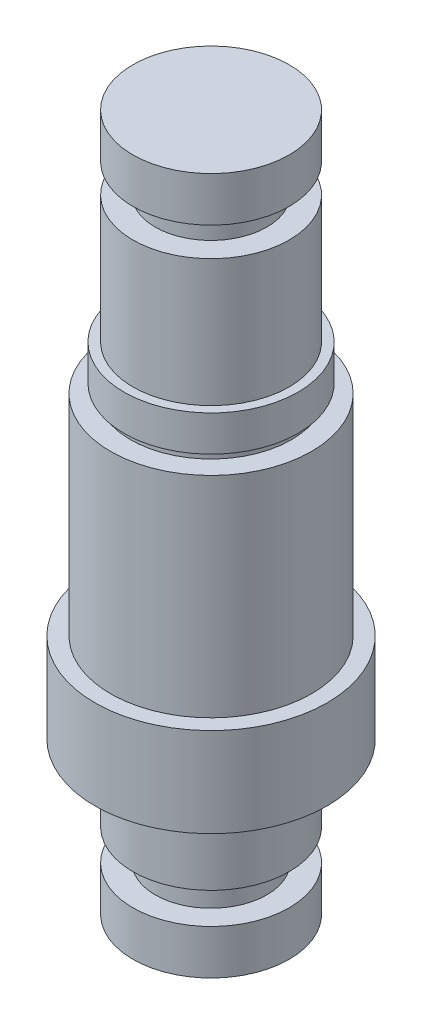
ISO-10303-21;
HEADER;
FILE_DESCRIPTION(('STEP AP214'),'2;1');
FILE_NAME('part.step','',(''),(''),'','','');
FILE_SCHEMA(('AUTOMOTIVE_DESIGN { 1 0 10303 214 1 1 1 1 }'));
ENDSEC;
DATA;
#1=APPLICATION_CONTEXT('core data for automotive mechanical design processes');
#2=APPLICATION_PROTOCOL_DEFINITION('international standard','automotive_design',2000,#1);
#3=PRODUCT_CONTEXT('',#1,'mechanical');
#4=PRODUCT('Part','Part','',(#3));
#5=PRODUCT_RELATED_PRODUCT_CATEGORY('part','',(#4));
#6=PRODUCT_DEFINITION_FORMATION('','',#4);
#7=PRODUCT_DEFINITION_CONTEXT('part definition',#1,'design');
#8=PRODUCT_DEFINITION('design','',#6,#7);
#9=PRODUCT_DEFINITION_SHAPE('','',#8);
#10=(LENGTH_UNIT() NAMED_UNIT(*) SI_UNIT(.MILLI.,.METRE.));
#11=(NAMED_UNIT(*) PLANE_ANGLE_UNIT() SI_UNIT($,.RADIAN.));
#12=(NAMED_UNIT(*) SI_UNIT($,.STERADIAN.) SOLID_ANGLE_UNIT());
#13=UNCERTAINTY_MEASURE_WITH_UNIT(LENGTH_MEASURE(1.E-05),#10,'distance_accuracy_value','');
#14=(GEOMETRIC_REPRESENTATION_CONTEXT(3) GLOBAL_UNCERTAINTY_ASSIGNED_CONTEXT((#13)) GLOBAL_UNIT_ASSIGNED_CONTEXT((#10,
#11,#12)) REPRESENTATION_CONTEXT('',''));
#15=CARTESIAN_POINT('',(0.,0.,0.));
#16=DIRECTION('',(0.,0.,1.));
#17=DIRECTION('',(1.,0.,0.));
#18=AXIS2_PLACEMENT_3D('',#15,#16,#17);
#19=CARTESIAN_POINT('',(0.,0.,0.));
#20=DIRECTION('',(0.,-1.,0.));
#21=DIRECTION('',(1.,0.,0.));
#22=AXIS2_PLACEMENT_3D('',#19,#20,#21);
#23=PLANE('',#22);
#24=CARTESIAN_POINT('',(0.,-1.11022302462516E-13,0.));
#25=DIRECTION('',(0.,-1.,0.));
#26=DIRECTION('',(1.,0.,0.));
#27=AXIS2_PLACEMENT_3D('',#24,#25,#26);
#28=CIRCLE('',#27,17.5);
#29=CARTESIAN_POINT('',(17.5,0.,0.));
#30=VERTEX_POINT('',#29);
#31=EDGE_CURVE('E10',#30,#30,#28,.T.);
#32=ORIENTED_EDGE('',*,*,#31,.T.);
#33=EDGE_LOOP('',(#32));
#34=FACE_BOUND('',#33,.T.);
#35=ADVANCED_FACE('F30',(#34),#23,.T.);
#36=CARTESIAN_POINT('',(3.49148336110938E-12,-1000.,0.));
#37=DIRECTION('',(0.,-1.,0.));
#38=DIRECTION('',(1.,0.,0.));
#39=AXIS2_PLACEMENT_3D('',#36,#37,#38);
#40=CYLINDRICAL_SURFACE('',#39,17.5);
#41=CARTESIAN_POINT('',(0.,10.,0.));
#42=DIRECTION('',(0.,-1.,0.));
#43=DIRECTION('',(1.,0.,0.));
#44=AXIS2_PLACEMENT_3D('',#41,#42,#43);
#45=CIRCLE('',#44,17.5);
#46=CARTESIAN_POINT('',(17.5,10.0000000000001,0.));
#47=VERTEX_POINT('',#46);
#48=EDGE_CURVE('E36',#47,#47,#45,.T.);
#49=ORIENTED_EDGE('',*,*,#48,.T.);
#50=EDGE_LOOP('',(#49));
#51=FACE_BOUND('',#50,.T.);
#52=ORIENTED_EDGE('',*,*,#31,.F.);
#53=EDGE_LOOP('',(#52));
#54=FACE_BOUND('',#53,.T.);
#55=ADVANCED_FACE('F110',(#51,#54),#40,.T.);
#56=CARTESIAN_POINT('',(17.5,10.,0.));
#57=DIRECTION('',(0.,1.,0.));
#58=DIRECTION('',(-1.,0.,0.));
#59=AXIS2_PLACEMENT_3D('',#56,#57,#58);
#60=PLANE('',#59);
#61=CARTESIAN_POINT('',(0.,10.,0.));
#62=DIRECTION('',(0.,-1.,0.));
#63=DIRECTION('',(1.,0.,0.));
#64=AXIS2_PLACEMENT_3D('',#61,#62,#63);
#65=CIRCLE('',#64,12.5);
#66=CARTESIAN_POINT('',(12.5,10.0000000000001,0.));
#67=VERTEX_POINT('',#66);
#68=EDGE_CURVE('E40',#67,#67,#65,.T.);
#69=ORIENTED_EDGE('',*,*,#68,.T.);
#70=EDGE_LOOP('',(#69));
#71=FACE_BOUND('',#70,.T.);
#72=ORIENTED_EDGE('',*,*,#48,.F.);
#73=EDGE_LOOP('',(#72));
#74=FACE_BOUND('',#73,.T.);
#75=ADVANCED_FACE('F114',(#71,#74),#60,.T.);
#76=CARTESIAN_POINT('',(3.49148336110938E-12,-1000.,0.));
#77=DIRECTION('',(0.,-1.,0.));
#78=DIRECTION('',(1.,0.,0.));
#79=AXIS2_PLACEMENT_3D('',#76,#77,#78);
#80=CYLINDRICAL_SURFACE('',#79,12.5);
#81=CARTESIAN_POINT('',(0.,16.9999999999999,0.));
#82=DIRECTION('',(0.,-1.,0.));
#83=DIRECTION('',(1.,0.,0.));
#84=AXIS2_PLACEMENT_3D('',#81,#82,#83);
#85=CIRCLE('',#84,12.5000000000001);
#86=CARTESIAN_POINT('',(12.5,17.,0.));
#87=VERTEX_POINT('',#86);
#88=EDGE_CURVE('E44',#87,#87,#85,.T.);
#89=ORIENTED_EDGE('',*,*,#88,.T.);
#90=EDGE_LOOP('',(#89));
#91=FACE_BOUND('',#90,.T.);
#92=ORIENTED_EDGE('',*,*,#68,.F.);
#93=EDGE_LOOP('',(#92));
#94=FACE_BOUND('',#93,.T.);
#95=ADVANCED_FACE('F118',(#91,#94),#80,.T.);
#96=CARTESIAN_POINT('',(12.5,17.,0.));
#97=DIRECTION('',(0.,-1.,0.));
#98=DIRECTION('',(1.,0.,0.));
#99=AXIS2_PLACEMENT_3D('',#96,#97,#98);
#100=PLANE('',#99);
#101=CARTESIAN_POINT('',(0.,16.9999999999999,0.));
#102=DIRECTION('',(0.,-1.,0.));
#103=DIRECTION('',(1.,0.,0.));
#104=AXIS2_PLACEMENT_3D('',#101,#102,#103);
#105=CIRCLE('',#104,17.5000000000001);
#106=CARTESIAN_POINT('',(17.5,17.,0.));
#107=VERTEX_POINT('',#106);
#108=EDGE_CURVE('E49',#107,#107,#105,.T.);
#109=ORIENTED_EDGE('',*,*,#108,.T.);
#110=EDGE_LOOP('',(#109));
#111=FACE_BOUND('',#110,.T.);
#112=ORIENTED_EDGE('',*,*,#88,.F.);
#113=EDGE_LOOP('',(#112));
#114=FACE_BOUND('',#113,.T.);
#115=ADVANCED_FACE('F125',(#111,#114),#100,.T.);
#116=CARTESIAN_POINT('',(3.49148336110938E-12,-1000.,0.));
#117=DIRECTION('',(0.,-1.,0.));
#118=DIRECTION('',(1.,0.,0.));
#119=AXIS2_PLACEMENT_3D('',#116,#117,#118);
#120=CYLINDRICAL_SURFACE('',#119,17.5000000000001);
#121=CARTESIAN_POINT('',(-1.18710434277719E-13,34.,0.));
#122=DIRECTION('',(0.,-1.,0.));
#123=DIRECTION('',(1.,0.,0.));
#124=AXIS2_PLACEMENT_3D('',#121,#122,#123);
#125=CIRCLE('',#124,17.5000000000001);
#126=CARTESIAN_POINT('',(17.5,34.0000000000001,0.));
#127=VERTEX_POINT('',#126);
#128=EDGE_CURVE('E52',#127,#127,#125,.T.);
#129=ORIENTED_EDGE('',*,*,#128,.T.);
#130=EDGE_LOOP('',(#129));
#131=FACE_BOUND('',#130,.T.);
#132=ORIENTED_EDGE('',*,*,#108,.F.);
#133=EDGE_LOOP('',(#132));
#134=FACE_BOUND('',#133,.T.);
#135=ADVANCED_FACE('F129',(#131,#134),#120,.T.);
#136=CARTESIAN_POINT('',(17.5,34.,0.));
#137=DIRECTION('',(0.,-1.,0.));
#138=DIRECTION('',(1.,0.,0.));
#139=AXIS2_PLACEMENT_3D('',#136,#137,#138);
#140=PLANE('',#139);
#141=CARTESIAN_POINT('',(-1.18710434277719E-13,34.,0.));
#142=DIRECTION('',(0.,-1.,0.));
#143=DIRECTION('',(1.,0.,0.));
#144=AXIS2_PLACEMENT_3D('',#141,#142,#143);
#145=CIRCLE('',#144,26.0000000000001);
#146=CARTESIAN_POINT('',(26.,34.0000000000001,0.));
#147=VERTEX_POINT('',#146);
#148=EDGE_CURVE('E55',#147,#147,#145,.T.);
#149=ORIENTED_EDGE('',*,*,#148,.T.);
#150=EDGE_LOOP('',(#149));
#151=FACE_BOUND('',#150,.T.);
#152=ORIENTED_EDGE('',*,*,#128,.F.);
#153=EDGE_LOOP('',(#152));
#154=FACE_BOUND('',#153,.T.);
#155=ADVANCED_FACE('F133',(#151,#154),#140,.T.);
#156=CARTESIAN_POINT('',(3.49148336110938E-12,-1000.,0.));
#157=DIRECTION('',(0.,-1.,0.));
#158=DIRECTION('',(1.,0.,0.));
#159=AXIS2_PLACEMENT_3D('',#156,#157,#158);
#160=CYLINDRICAL_SURFACE('',#159,26.0000000000001);
#161=CARTESIAN_POINT('',(-1.88540101499907E-13,54.,0.));
#162=DIRECTION('',(0.,-1.,0.));
#163=DIRECTION('',(1.,0.,0.));
#164=AXIS2_PLACEMENT_3D('',#161,#162,#163);
#165=CIRCLE('',#164,26.0000000000002);
#166=CARTESIAN_POINT('',(26.,54.0000000000001,0.));
#167=VERTEX_POINT('',#166);
#168=EDGE_CURVE('E58',#167,#167,#165,.T.);
#169=ORIENTED_EDGE('',*,*,#168,.T.);
#170=EDGE_LOOP('',(#169));
#171=FACE_BOUND('',#170,.T.);
#172=ORIENTED_EDGE('',*,*,#148,.F.);
#173=EDGE_LOOP('',(#172));
#174=FACE_BOUND('',#173,.T.);
#175=ADVANCED_FACE('F137',(#171,#174),#160,.T.);
#176=CARTESIAN_POINT('',(26.,54.,0.));
#177=DIRECTION('',(0.,1.,0.));
#178=DIRECTION('',(-1.,0.,0.));
#179=AXIS2_PLACEMENT_3D('',#176,#177,#178);
#180=PLANE('',#179);
#181=CARTESIAN_POINT('',(-1.88540101499907E-13,54.,0.));
#182=DIRECTION('',(0.,-1.,0.));
#183=DIRECTION('',(1.,0.,0.));
#184=AXIS2_PLACEMENT_3D('',#181,#182,#183);
#185=CIRCLE('',#184,22.5000000000002);
#186=CARTESIAN_POINT('',(22.5,54.0000000000001,0.));
#187=VERTEX_POINT('',#186);
#188=EDGE_CURVE('E61',#187,#187,#185,.T.);
#189=ORIENTED_EDGE('',*,*,#188,.T.);
#190=EDGE_LOOP('',(#189));
#191=FACE_BOUND('',#190,.T.);
#192=ORIENTED_EDGE('',*,*,#168,.F.);
#193=EDGE_LOOP('',(#192));
#194=FACE_BOUND('',#193,.T.);
#195=ADVANCED_FACE('F141',(#191,#194),#180,.T.);
#196=CARTESIAN_POINT('',(3.49148336110938E-12,-1000.,0.));
#197=DIRECTION('',(0.,-1.,0.));
#198=DIRECTION('',(1.,0.,0.));
#199=AXIS2_PLACEMENT_3D('',#196,#197,#198);
#200=CYLINDRICAL_SURFACE('',#199,22.5000000000003);
#201=CARTESIAN_POINT('',(-3.52639819472047E-13,101.,0.));
#202=DIRECTION('',(0.,-1.,0.));
#203=DIRECTION('',(1.,0.,0.));
#204=AXIS2_PLACEMENT_3D('',#201,#202,#203);
#205=CIRCLE('',#204,22.5000000000004);
#206=CARTESIAN_POINT('',(22.5,101.,0.));
#207=VERTEX_POINT('',#206);
#208=EDGE_CURVE('E64',#207,#207,#205,.T.);
#209=ORIENTED_EDGE('',*,*,#208,.T.);
#210=EDGE_LOOP('',(#209));
#211=FACE_BOUND('',#210,.T.);
#212=ORIENTED_EDGE('',*,*,#188,.F.);
#213=EDGE_LOOP('',(#212));
#214=FACE_BOUND('',#213,.T.);
#215=ADVANCED_FACE('F145',(#211,#214),#200,.T.);
#216=CARTESIAN_POINT('',(18.,101.,0.));
#217=DIRECTION('',(0.,1.,0.));
#218=DIRECTION('',(-1.,0.,0.));
#219=AXIS2_PLACEMENT_3D('',#216,#217,#218);
#220=PLANE('',#219);
#221=CARTESIAN_POINT('',(-3.52639819472047E-13,101.,0.));
#222=DIRECTION('',(0.,-1.,0.));
#223=DIRECTION('',(1.,0.,0.));
#224=AXIS2_PLACEMENT_3D('',#221,#222,#223);
#225=CIRCLE('',#224,18.0000000000004);
#226=CARTESIAN_POINT('',(18.,101.,0.));
#227=VERTEX_POINT('',#226);
#228=EDGE_CURVE('E67',#227,#227,#225,.T.);
#229=ORIENTED_EDGE('',*,*,#228,.T.);
#230=EDGE_LOOP('',(#229));
#231=FACE_BOUND('',#230,.T.);
#232=ORIENTED_EDGE('',*,*,#208,.F.);
#233=EDGE_LOOP('',(#232));
#234=FACE_BOUND('',#233,.T.);
#235=ADVANCED_FACE('F149',(#231,#234),#220,.T.);
#236=CARTESIAN_POINT('',(3.49148336110938E-12,-1000.,0.));
#237=DIRECTION('',(0.,-1.,0.));
#238=DIRECTION('',(1.,0.,0.));
#239=AXIS2_PLACEMENT_3D('',#236,#237,#238);
#240=CYLINDRICAL_SURFACE('',#239,18.0000000000004);
#241=CARTESIAN_POINT('',(-3.59622786194266E-13,103.,0.));
#242=DIRECTION('',(0.,-1.,0.));
#243=DIRECTION('',(1.,0.,0.));
#244=AXIS2_PLACEMENT_3D('',#241,#242,#243);
#245=CIRCLE('',#244,18.0000000000004);
#246=CARTESIAN_POINT('',(18.,103.,0.));
#247=VERTEX_POINT('',#246);
#248=EDGE_CURVE('E70',#247,#247,#245,.T.);
#249=ORIENTED_EDGE('',*,*,#248,.T.);
#250=EDGE_LOOP('',(#249));
#251=FACE_BOUND('',#250,.T.);
#252=ORIENTED_EDGE('',*,*,#228,.F.);
#253=EDGE_LOOP('',(#252));
#254=FACE_BOUND('',#253,.T.);
#255=ADVANCED_FACE('F153',(#251,#254),#240,.T.);
#256=CARTESIAN_POINT('',(19.5,103.,0.));
#257=DIRECTION('',(0.,-1.,0.));
#258=DIRECTION('',(1.,0.,0.));
#259=AXIS2_PLACEMENT_3D('',#256,#257,#258);
#260=PLANE('',#259);
#261=CARTESIAN_POINT('',(-3.59622786194266E-13,103.,0.));
#262=DIRECTION('',(0.,-1.,0.));
#263=DIRECTION('',(1.,0.,0.));
#264=AXIS2_PLACEMENT_3D('',#261,#262,#263);
#265=CIRCLE('',#264,19.5000000000003);
#266=CARTESIAN_POINT('',(19.5,103.,0.));
#267=VERTEX_POINT('',#266);
#268=EDGE_CURVE('E73',#267,#267,#265,.T.);
#269=ORIENTED_EDGE('',*,*,#268,.T.);
#270=EDGE_LOOP('',(#269));
#271=FACE_BOUND('',#270,.T.);
#272=ORIENTED_EDGE('',*,*,#248,.F.);
#273=EDGE_LOOP('',(#272));
#274=FACE_BOUND('',#273,.T.);
#275=ADVANCED_FACE('F157',(#271,#274),#260,.T.);
#276=CARTESIAN_POINT('',(3.49148336110938E-12,-1000.,0.));
#277=DIRECTION('',(0.,-1.,0.));
#278=DIRECTION('',(1.,0.,0.));
#279=AXIS2_PLACEMENT_3D('',#276,#277,#278);
#280=CYLINDRICAL_SURFACE('',#279,19.5000000000003);
#281=CARTESIAN_POINT('',(-3.87554653083141E-13,111.,0.));
#282=DIRECTION('',(0.,-1.,0.));
#283=DIRECTION('',(1.,0.,0.));
#284=AXIS2_PLACEMENT_3D('',#281,#282,#283);
#285=CIRCLE('',#284,19.5000000000004);
#286=CARTESIAN_POINT('',(19.5,111.,0.));
#287=VERTEX_POINT('',#286);
#288=EDGE_CURVE('E76',#287,#287,#285,.T.);
#289=ORIENTED_EDGE('',*,*,#288,.T.);
#290=EDGE_LOOP('',(#289));
#291=FACE_BOUND('',#290,.T.);
#292=ORIENTED_EDGE('',*,*,#268,.F.);
#293=EDGE_LOOP('',(#292));
#294=FACE_BOUND('',#293,.T.);
#295=ADVANCED_FACE('F161',(#291,#294),#280,.T.);
#296=CARTESIAN_POINT('',(17.5,111.,0.));
#297=DIRECTION('',(0.,1.,0.));
#298=DIRECTION('',(-1.,0.,0.));
#299=AXIS2_PLACEMENT_3D('',#296,#297,#298);
#300=PLANE('',#299);
#301=CARTESIAN_POINT('',(-3.87554653083141E-13,111.,0.));
#302=DIRECTION('',(0.,-1.,0.));
#303=DIRECTION('',(1.,0.,0.));
#304=AXIS2_PLACEMENT_3D('',#301,#302,#303);
#305=CIRCLE('',#304,17.5000000000004);
#306=CARTESIAN_POINT('',(17.5,111.,0.));
#307=VERTEX_POINT('',#306);
#308=EDGE_CURVE('E79',#307,#307,#305,.T.);
#309=ORIENTED_EDGE('',*,*,#308,.T.);
#310=EDGE_LOOP('',(#309));
#311=FACE_BOUND('',#310,.T.);
#312=ORIENTED_EDGE('',*,*,#288,.F.);
#313=EDGE_LOOP('',(#312));
#314=FACE_BOUND('',#313,.T.);
#315=ADVANCED_FACE('F165',(#311,#314),#300,.T.);
#316=CARTESIAN_POINT('',(3.49148336110938E-12,-1000.,0.));
#317=DIRECTION('',(0.,-1.,0.));
#318=DIRECTION('',(1.,0.,0.));
#319=AXIS2_PLACEMENT_3D('',#316,#317,#318);
#320=CYLINDRICAL_SURFACE('',#319,17.5000000000004);
#321=CARTESIAN_POINT('',(-4.87061928874759E-13,139.5,0.));
#322=DIRECTION('',(0.,-1.,0.));
#323=DIRECTION('',(1.,0.,0.));
#324=AXIS2_PLACEMENT_3D('',#321,#322,#323);
#325=CIRCLE('',#324,17.5000000000005);
#326=CARTESIAN_POINT('',(17.5,139.5,0.));
#327=VERTEX_POINT('',#326);
#328=EDGE_CURVE('E82',#327,#327,#325,.T.);
#329=ORIENTED_EDGE('',*,*,#328,.T.);
#330=EDGE_LOOP('',(#329));
#331=FACE_BOUND('',#330,.T.);
#332=ORIENTED_EDGE('',*,*,#308,.F.);
#333=EDGE_LOOP('',(#332));
#334=FACE_BOUND('',#333,.T.);
#335=ADVANCED_FACE('F169',(#331,#334),#320,.T.);
#336=CARTESIAN_POINT('',(12.5,139.5,0.));
#337=DIRECTION('',(0.,1.,0.));
#338=DIRECTION('',(-1.,0.,0.));
#339=AXIS2_PLACEMENT_3D('',#336,#337,#338);
#340=PLANE('',#339);
#341=CARTESIAN_POINT('',(-4.87061928874759E-13,139.5,0.));
#342=DIRECTION('',(0.,-1.,0.));
#343=DIRECTION('',(1.,0.,0.));
#344=AXIS2_PLACEMENT_3D('',#341,#342,#343);
#345=CIRCLE('',#344,12.5000000000004);
#346=CARTESIAN_POINT('',(12.5,139.5,0.));
#347=VERTEX_POINT('',#346);
#348=EDGE_CURVE('E85',#347,#347,#345,.T.);
#349=ORIENTED_EDGE('',*,*,#348,.T.);
#350=EDGE_LOOP('',(#349));
#351=FACE_BOUND('',#350,.T.);
#352=ORIENTED_EDGE('',*,*,#328,.F.);
#353=EDGE_LOOP('',(#352));
#354=FACE_BOUND('',#353,.T.);
#355=ADVANCED_FACE('F173',(#351,#354),#340,.T.);
#356=CARTESIAN_POINT('',(3.49148336110938E-12,-1000.,0.));
#357=DIRECTION('',(0.,-1.,0.));
#358=DIRECTION('',(1.,0.,0.));
#359=AXIS2_PLACEMENT_3D('',#356,#357,#358);
#360=CYLINDRICAL_SURFACE('',#359,12.5000000000005);
#361=CARTESIAN_POINT('',(-5.09756570721969E-13,146.,0.));
#362=DIRECTION('',(0.,-1.,0.));
#363=DIRECTION('',(1.,0.,0.));
#364=AXIS2_PLACEMENT_3D('',#361,#362,#363);
#365=CIRCLE('',#364,12.5000000000005);
#366=CARTESIAN_POINT('',(12.5,146.,0.));
#367=VERTEX_POINT('',#366);
#368=EDGE_CURVE('E88',#367,#367,#365,.T.);
#369=ORIENTED_EDGE('',*,*,#368,.T.);
#370=EDGE_LOOP('',(#369));
#371=FACE_BOUND('',#370,.T.);
#372=ORIENTED_EDGE('',*,*,#348,.F.);
#373=EDGE_LOOP('',(#372));
#374=FACE_BOUND('',#373,.T.);
#375=ADVANCED_FACE('F177',(#371,#374),#360,.T.);
#376=CARTESIAN_POINT('',(17.5,146.,0.));
#377=DIRECTION('',(0.,-1.,0.));
#378=DIRECTION('',(1.,0.,0.));
#379=AXIS2_PLACEMENT_3D('',#376,#377,#378);
#380=PLANE('',#379);
#381=CARTESIAN_POINT('',(-5.09756570721969E-13,146.,0.));
#382=DIRECTION('',(0.,-1.,0.));
#383=DIRECTION('',(1.,0.,0.));
#384=AXIS2_PLACEMENT_3D('',#381,#382,#383);
#385=CIRCLE('',#384,17.5000000000005);
#386=CARTESIAN_POINT('',(17.5,146.,0.));
#387=VERTEX_POINT('',#386);
#388=EDGE_CURVE('E91',#387,#387,#385,.T.);
#389=ORIENTED_EDGE('',*,*,#388,.T.);
#390=EDGE_LOOP('',(#389));
#391=FACE_BOUND('',#390,.T.);
#392=ORIENTED_EDGE('',*,*,#368,.F.);
#393=EDGE_LOOP('',(#392));
#394=FACE_BOUND('',#393,.T.);
#395=ADVANCED_FACE('F107',(#391,#394),#380,.T.);
#396=CARTESIAN_POINT('',(3.49148336110938E-12,-1000.,0.));
#397=DIRECTION('',(0.,-1.,0.));
#398=DIRECTION('',(1.,0.,0.));
#399=AXIS2_PLACEMENT_3D('',#396,#397,#398);
#400=CYLINDRICAL_SURFACE('',#399,17.5000000000005);
#401=CARTESIAN_POINT('',(-5.44671404333063E-13,156.,0.));
#402=DIRECTION('',(0.,-1.,0.));
#403=DIRECTION('',(1.,0.,0.));
#404=AXIS2_PLACEMENT_3D('',#401,#402,#403);
#405=CIRCLE('',#404,17.5000000000006);
#406=CARTESIAN_POINT('',(17.5,156.,0.));
#407=VERTEX_POINT('',#406);
#408=EDGE_CURVE('E94',#407,#407,#405,.T.);
#409=ORIENTED_EDGE('',*,*,#408,.T.);
#410=EDGE_LOOP('',(#409));
#411=FACE_BOUND('',#410,.T.);
#412=ORIENTED_EDGE('',*,*,#388,.F.);
#413=EDGE_LOOP('',(#412));
#414=FACE_BOUND('',#413,.T.);
#415=ADVANCED_FACE('F98',(#411,#414),#400,.T.);
#416=CARTESIAN_POINT('',(0.,156.,0.));
#417=DIRECTION('',(0.,1.,0.));
#418=DIRECTION('',(-1.,0.,0.));
#419=AXIS2_PLACEMENT_3D('',#416,#417,#418);
#420=PLANE('',#419);
#421=ORIENTED_EDGE('',*,*,#408,.F.);
#422=EDGE_LOOP('',(#421));
#423=FACE_BOUND('',#422,.T.);
#424=ADVANCED_FACE('F101',(#423),#420,.T.);
#425=CLOSED_SHELL('',(#35,#55,#75,#95,#115,#135,#155,#175,#195,#215,#235,#255,#275,#295,#315,
#335,#355,#375,#395,#415,#424));
#426=MANIFOLD_SOLID_BREP('B2',#425);
#427=ADVANCED_BREP_SHAPE_REPRESENTATION('',(#18,#426),#14);
#428=SHAPE_DEFINITION_REPRESENTATION(#9,#427);
ENDSEC;
END-ISO-10303-21;
